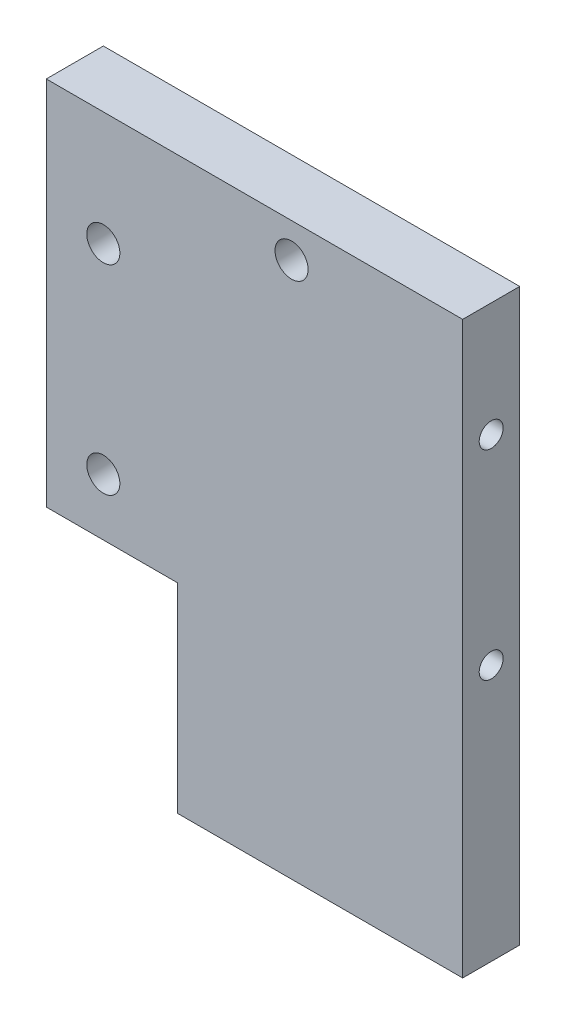
ISO-10303-21;
HEADER;
FILE_DESCRIPTION(('STEP AP214'),'2;1');
FILE_NAME('part.step','',(''),(''),'','','');
FILE_SCHEMA(('AUTOMOTIVE_DESIGN { 1 0 10303 214 1 1 1 1 }'));
ENDSEC;
DATA;
#1=APPLICATION_CONTEXT('core data for automotive mechanical design processes');
#2=APPLICATION_PROTOCOL_DEFINITION('international standard','automotive_design',2000,#1);
#3=PRODUCT_CONTEXT('',#1,'mechanical');
#4=PRODUCT('Part','Part','',(#3));
#5=PRODUCT_RELATED_PRODUCT_CATEGORY('part','',(#4));
#6=PRODUCT_DEFINITION_FORMATION('','',#4);
#7=PRODUCT_DEFINITION_CONTEXT('part definition',#1,'design');
#8=PRODUCT_DEFINITION('design','',#6,#7);
#9=PRODUCT_DEFINITION_SHAPE('','',#8);
#10=(LENGTH_UNIT() NAMED_UNIT(*) SI_UNIT(.MILLI.,.METRE.));
#11=(NAMED_UNIT(*) PLANE_ANGLE_UNIT() SI_UNIT($,.RADIAN.));
#12=(NAMED_UNIT(*) SI_UNIT($,.STERADIAN.) SOLID_ANGLE_UNIT());
#13=UNCERTAINTY_MEASURE_WITH_UNIT(LENGTH_MEASURE(1.E-05),#10,'distance_accuracy_value','');
#14=(GEOMETRIC_REPRESENTATION_CONTEXT(3) GLOBAL_UNCERTAINTY_ASSIGNED_CONTEXT((#13)) GLOBAL_UNIT_ASSIGNED_CONTEXT((#10,
#11,#12)) REPRESENTATION_CONTEXT('',''));
#15=CARTESIAN_POINT('',(0.,0.,0.));
#16=DIRECTION('',(0.,0.,1.));
#17=DIRECTION('',(1.,0.,0.));
#18=AXIS2_PLACEMENT_3D('',#15,#16,#17);
#19=CARTESIAN_POINT('',(0.,0.,10.));
#20=DIRECTION('',(1.,0.,0.));
#21=DIRECTION('',(0.,0.,-1.));
#22=AXIS2_PLACEMENT_3D('',#19,#20,#21);
#23=PLANE('',#22);
#24=DIRECTION('',(0.,-1.,0.));
#25=VECTOR('',#24,1.);
#26=CARTESIAN_POINT('',(0.,0.,0.));
#27=LINE('',#26,#25);
#28=CARTESIAN_POINT('',(0.,100.,0.));
#29=VERTEX_POINT('',#28);
#30=CARTESIAN_POINT('',(0.,35.,0.));
#31=VERTEX_POINT('',#30);
#32=EDGE_CURVE('E113',#29,#31,#27,.T.);
#33=ORIENTED_EDGE('',*,*,#32,.T.);
#34=DIRECTION('',(0.,0.,-1.));
#35=VECTOR('',#34,1.);
#36=CARTESIAN_POINT('',(0.,35.,10.));
#37=LINE('',#36,#35);
#38=CARTESIAN_POINT('',(0.,35.,10.));
#39=VERTEX_POINT('',#38);
#40=EDGE_CURVE('E48',#39,#31,#37,.T.);
#41=ORIENTED_EDGE('',*,*,#40,.F.);
#42=DIRECTION('',(0.,-1.,0.));
#43=VECTOR('',#42,1.);
#44=CARTESIAN_POINT('',(0.,0.,10.));
#45=LINE('',#44,#43);
#46=CARTESIAN_POINT('',(0.,100.,10.));
#47=VERTEX_POINT('',#46);
#48=EDGE_CURVE('E111',#47,#39,#45,.T.);
#49=ORIENTED_EDGE('',*,*,#48,.F.);
#50=DIRECTION('',(0.,0.,-1.));
#51=VECTOR('',#50,1.);
#52=CARTESIAN_POINT('',(0.,100.,10.));
#53=LINE('',#52,#51);
#54=EDGE_CURVE('E127',#47,#29,#53,.T.);
#55=ORIENTED_EDGE('',*,*,#54,.T.);
#56=EDGE_LOOP('',(#33,#41,#49,#55));
#57=FACE_BOUND('',#56,.T.);
#58=ADVANCED_FACE('F34',(#57),#23,.F.);
#59=CARTESIAN_POINT('',(0.,0.,10.));
#60=DIRECTION('',(0.,1.,0.));
#61=DIRECTION('',(0.,0.,1.));
#62=AXIS2_PLACEMENT_3D('',#59,#60,#61);
#63=PLANE('',#62);
#64=DIRECTION('',(1.,0.,0.));
#65=VECTOR('',#64,1.);
#66=CARTESIAN_POINT('',(0.,0.,10.));
#67=LINE('',#66,#65);
#68=CARTESIAN_POINT('',(23.,0.,10.));
#69=VERTEX_POINT('',#68);
#70=CARTESIAN_POINT('',(73.,0.,10.));
#71=VERTEX_POINT('',#70);
#72=EDGE_CURVE('E79',#69,#71,#67,.T.);
#73=ORIENTED_EDGE('',*,*,#72,.F.);
#74=DIRECTION('',(0.,0.,-1.));
#75=VECTOR('',#74,1.);
#76=CARTESIAN_POINT('',(23.,0.,10.));
#77=LINE('',#76,#75);
#78=CARTESIAN_POINT('',(23.,0.,0.));
#79=VERTEX_POINT('',#78);
#80=EDGE_CURVE('E147',#69,#79,#77,.T.);
#81=ORIENTED_EDGE('',*,*,#80,.T.);
#82=DIRECTION('',(1.,0.,0.));
#83=VECTOR('',#82,1.);
#84=CARTESIAN_POINT('',(0.,0.,0.));
#85=LINE('',#84,#83);
#86=CARTESIAN_POINT('',(73.,0.,0.));
#87=VERTEX_POINT('',#86);
#88=EDGE_CURVE('E129',#79,#87,#85,.T.);
#89=ORIENTED_EDGE('',*,*,#88,.T.);
#90=DIRECTION('',(0.,0.,-1.));
#91=VECTOR('',#90,1.);
#92=CARTESIAN_POINT('',(73.,0.,10.));
#93=LINE('',#92,#91);
#94=EDGE_CURVE('E11',#71,#87,#93,.T.);
#95=ORIENTED_EDGE('',*,*,#94,.F.);
#96=EDGE_LOOP('',(#73,#81,#89,#95));
#97=FACE_BOUND('',#96,.T.);
#98=ADVANCED_FACE('F215',(#97),#63,.F.);
#99=CARTESIAN_POINT('',(73.,0.,10.));
#100=DIRECTION('',(-1.,0.,0.));
#101=DIRECTION('',(0.,0.,1.));
#102=AXIS2_PLACEMENT_3D('',#99,#100,#101);
#103=PLANE('',#102);
#104=CARTESIAN_POINT('',(73.,80.0000000000001,4.99999999999991));
#105=DIRECTION('',(1.,0.,0.));
#106=DIRECTION('',(0.,0.,-1.));
#107=AXIS2_PLACEMENT_3D('',#104,#105,#106);
#108=CIRCLE('',#107,2.1);
#109=CARTESIAN_POINT('',(73.,80.0000000000001,2.89999999999991));
#110=VERTEX_POINT('',#109);
#111=EDGE_CURVE('E150',#110,#110,#108,.T.);
#112=ORIENTED_EDGE('',*,*,#111,.F.);
#113=EDGE_LOOP('',(#112));
#114=FACE_BOUND('',#113,.T.);
#115=CARTESIAN_POINT('',(73.,45.0000000000001,4.99999999999991));
#116=DIRECTION('',(1.,0.,0.));
#117=DIRECTION('',(0.,0.,-1.));
#118=AXIS2_PLACEMENT_3D('',#115,#116,#117);
#119=CIRCLE('',#118,2.1);
#120=CARTESIAN_POINT('',(73.,45.0000000000001,2.89999999999991));
#121=VERTEX_POINT('',#120);
#122=EDGE_CURVE('E157',#121,#121,#119,.T.);
#123=ORIENTED_EDGE('',*,*,#122,.F.);
#124=EDGE_LOOP('',(#123));
#125=FACE_BOUND('',#124,.T.);
#126=DIRECTION('',(0.,1.,0.));
#127=VECTOR('',#126,1.);
#128=CARTESIAN_POINT('',(73.,0.,0.));
#129=LINE('',#128,#127);
#130=CARTESIAN_POINT('',(73.,100.,0.));
#131=VERTEX_POINT('',#130);
#132=EDGE_CURVE('E119',#87,#131,#129,.T.);
#133=ORIENTED_EDGE('',*,*,#132,.T.);
#134=DIRECTION('',(0.,0.,-1.));
#135=VECTOR('',#134,1.);
#136=CARTESIAN_POINT('',(73.,100.,10.));
#137=LINE('',#136,#135);
#138=CARTESIAN_POINT('',(73.,100.,10.));
#139=VERTEX_POINT('',#138);
#140=EDGE_CURVE('E41',#139,#131,#137,.T.);
#141=ORIENTED_EDGE('',*,*,#140,.F.);
#142=DIRECTION('',(0.,1.,0.));
#143=VECTOR('',#142,1.);
#144=CARTESIAN_POINT('',(73.,0.,10.));
#145=LINE('',#144,#143);
#146=EDGE_CURVE('E117',#71,#139,#145,.T.);
#147=ORIENTED_EDGE('',*,*,#146,.F.);
#148=ORIENTED_EDGE('',*,*,#94,.T.);
#149=EDGE_LOOP('',(#133,#141,#147,#148));
#150=FACE_BOUND('',#149,.T.);
#151=ADVANCED_FACE('F220',(#114,#125,#150),#103,.F.);
#152=CARTESIAN_POINT('',(0.,100.,10.));
#153=DIRECTION('',(0.,-1.,0.));
#154=DIRECTION('',(0.,0.,-1.));
#155=AXIS2_PLACEMENT_3D('',#152,#153,#154);
#156=PLANE('',#155);
#157=DIRECTION('',(-1.,0.,0.));
#158=VECTOR('',#157,1.);
#159=CARTESIAN_POINT('',(0.,100.,0.));
#160=LINE('',#159,#158);
#161=EDGE_CURVE('E74',#131,#29,#160,.T.);
#162=ORIENTED_EDGE('',*,*,#161,.T.);
#163=ORIENTED_EDGE('',*,*,#54,.F.);
#164=DIRECTION('',(-1.,0.,0.));
#165=VECTOR('',#164,1.);
#166=CARTESIAN_POINT('',(0.,100.,10.));
#167=LINE('',#166,#165);
#168=EDGE_CURVE('E57',#139,#47,#167,.T.);
#169=ORIENTED_EDGE('',*,*,#168,.F.);
#170=ORIENTED_EDGE('',*,*,#140,.T.);
#171=EDGE_LOOP('',(#162,#163,#169,#170));
#172=FACE_BOUND('',#171,.T.);
#173=ADVANCED_FACE('F133',(#172),#156,.F.);
#174=CARTESIAN_POINT('',(0.,100.,10.));
#175=DIRECTION('',(0.,0.,-1.));
#176=DIRECTION('',(-1.,0.,0.));
#177=AXIS2_PLACEMENT_3D('',#174,#175,#176);
#178=PLANE('',#177);
#179=CARTESIAN_POINT('',(10.,80.,10.));
#180=DIRECTION('',(0.,0.,-1.));
#181=DIRECTION('',(-1.,0.,0.));
#182=AXIS2_PLACEMENT_3D('',#179,#180,#181);
#183=CIRCLE('',#182,2.9);
#184=CARTESIAN_POINT('',(7.10000000000001,80.,10.));
#185=VERTEX_POINT('',#184);
#186=EDGE_CURVE('E172',#185,#185,#183,.T.);
#187=ORIENTED_EDGE('',*,*,#186,.T.);
#188=EDGE_LOOP('',(#187));
#189=FACE_BOUND('',#188,.T.);
#190=CARTESIAN_POINT('',(43.,94.,10.));
#191=DIRECTION('',(0.,0.,-1.));
#192=DIRECTION('',(-1.,0.,0.));
#193=AXIS2_PLACEMENT_3D('',#190,#191,#192);
#194=CIRCLE('',#193,2.9);
#195=CARTESIAN_POINT('',(40.1,94.,10.));
#196=VERTEX_POINT('',#195);
#197=EDGE_CURVE('E184',#196,#196,#194,.T.);
#198=ORIENTED_EDGE('',*,*,#197,.T.);
#199=EDGE_LOOP('',(#198));
#200=FACE_BOUND('',#199,.T.);
#201=CARTESIAN_POINT('',(10.,45.,10.));
#202=DIRECTION('',(0.,0.,-1.));
#203=DIRECTION('',(-1.,0.,0.));
#204=AXIS2_PLACEMENT_3D('',#201,#202,#203);
#205=CIRCLE('',#204,2.9);
#206=CARTESIAN_POINT('',(7.10000000000001,45.,10.));
#207=VERTEX_POINT('',#206);
#208=EDGE_CURVE('E122',#207,#207,#205,.T.);
#209=ORIENTED_EDGE('',*,*,#208,.T.);
#210=EDGE_LOOP('',(#209));
#211=FACE_BOUND('',#210,.T.);
#212=DIRECTION('',(1.,0.,0.));
#213=VECTOR('',#212,1.);
#214=CARTESIAN_POINT('',(0.,35.,10.));
#215=LINE('',#214,#213);
#216=CARTESIAN_POINT('',(23.,35.,10.));
#217=VERTEX_POINT('',#216);
#218=EDGE_CURVE('E101',#39,#217,#215,.T.);
#219=ORIENTED_EDGE('',*,*,#218,.T.);
#220=DIRECTION('',(0.,-1.,0.));
#221=VECTOR('',#220,1.);
#222=CARTESIAN_POINT('',(23.,0.,10.));
#223=LINE('',#222,#221);
#224=EDGE_CURVE('E105',#217,#69,#223,.T.);
#225=ORIENTED_EDGE('',*,*,#224,.T.);
#226=ORIENTED_EDGE('',*,*,#72,.T.);
#227=ORIENTED_EDGE('',*,*,#146,.T.);
#228=ORIENTED_EDGE('',*,*,#168,.T.);
#229=ORIENTED_EDGE('',*,*,#48,.T.);
#230=EDGE_LOOP('',(#219,#225,#226,#227,#228,#229));
#231=FACE_BOUND('',#230,.T.);
#232=ADVANCED_FACE('F115',(#189,#200,#211,#231),#178,.F.);
#233=CARTESIAN_POINT('',(0.,100.,0.));
#234=DIRECTION('',(0.,0.,-1.));
#235=DIRECTION('',(-1.,0.,0.));
#236=AXIS2_PLACEMENT_3D('',#233,#234,#235);
#237=PLANE('',#236);
#238=DIRECTION('',(0.,-1.,0.));
#239=VECTOR('',#238,1.);
#240=CARTESIAN_POINT('',(23.,0.,0.));
#241=LINE('',#240,#239);
#242=CARTESIAN_POINT('',(23.,35.,0.));
#243=VERTEX_POINT('',#242);
#244=EDGE_CURVE('E106',#243,#79,#241,.T.);
#245=ORIENTED_EDGE('',*,*,#244,.F.);
#246=DIRECTION('',(1.,0.,0.));
#247=VECTOR('',#246,1.);
#248=CARTESIAN_POINT('',(0.,35.,0.));
#249=LINE('',#248,#247);
#250=EDGE_CURVE('E142',#31,#243,#249,.T.);
#251=ORIENTED_EDGE('',*,*,#250,.F.);
#252=ORIENTED_EDGE('',*,*,#32,.F.);
#253=ORIENTED_EDGE('',*,*,#161,.F.);
#254=ORIENTED_EDGE('',*,*,#132,.F.);
#255=ORIENTED_EDGE('',*,*,#88,.F.);
#256=EDGE_LOOP('',(#245,#251,#252,#253,#254,#255));
#257=FACE_BOUND('',#256,.T.);
#258=CARTESIAN_POINT('',(10.,80.,0.));
#259=DIRECTION('',(0.,0.,-1.));
#260=DIRECTION('',(-1.,0.,0.));
#261=AXIS2_PLACEMENT_3D('',#258,#259,#260);
#262=CIRCLE('',#261,4.99999999999999);
#263=CARTESIAN_POINT('',(5.00000000000002,80.,0.));
#264=VERTEX_POINT('',#263);
#265=EDGE_CURVE('E163',#264,#264,#262,.T.);
#266=ORIENTED_EDGE('',*,*,#265,.F.);
#267=EDGE_LOOP('',(#266));
#268=FACE_BOUND('',#267,.T.);
#269=CARTESIAN_POINT('',(43.,94.,0.));
#270=DIRECTION('',(0.,0.,-1.));
#271=DIRECTION('',(-1.,0.,0.));
#272=AXIS2_PLACEMENT_3D('',#269,#270,#271);
#273=CIRCLE('',#272,4.99999999999999);
#274=CARTESIAN_POINT('',(38.,94.,0.));
#275=VERTEX_POINT('',#274);
#276=EDGE_CURVE('E175',#275,#275,#273,.T.);
#277=ORIENTED_EDGE('',*,*,#276,.F.);
#278=EDGE_LOOP('',(#277));
#279=FACE_BOUND('',#278,.T.);
#280=CARTESIAN_POINT('',(10.,45.,0.));
#281=DIRECTION('',(0.,0.,-1.));
#282=DIRECTION('',(-1.,0.,0.));
#283=AXIS2_PLACEMENT_3D('',#280,#281,#282);
#284=CIRCLE('',#283,4.99999999999999);
#285=CARTESIAN_POINT('',(5.00000000000002,45.,0.));
#286=VERTEX_POINT('',#285);
#287=EDGE_CURVE('E187',#286,#286,#284,.T.);
#288=ORIENTED_EDGE('',*,*,#287,.F.);
#289=EDGE_LOOP('',(#288));
#290=FACE_BOUND('',#289,.T.);
#291=ADVANCED_FACE('F139',(#257,#268,#279,#290),#237,.T.);
#292=CARTESIAN_POINT('',(10.,45.,0.));
#293=DIRECTION('',(0.,0.,-1.));
#294=DIRECTION('',(-1.,0.,0.));
#295=AXIS2_PLACEMENT_3D('',#292,#293,#294);
#296=CYLINDRICAL_SURFACE('',#295,2.9);
#297=ORIENTED_EDGE('',*,*,#208,.F.);
#298=EDGE_LOOP('',(#297));
#299=FACE_BOUND('',#298,.T.);
#300=CARTESIAN_POINT('',(10.,45.,5.));
#301=DIRECTION('',(0.,0.,-1.));
#302=DIRECTION('',(-1.,0.,0.));
#303=AXIS2_PLACEMENT_3D('',#300,#301,#302);
#304=CIRCLE('',#303,2.90000000000001);
#305=CARTESIAN_POINT('',(7.1,45.,5.));
#306=VERTEX_POINT('',#305);
#307=EDGE_CURVE('E192',#306,#306,#304,.T.);
#308=ORIENTED_EDGE('',*,*,#307,.T.);
#309=EDGE_LOOP('',(#308));
#310=FACE_BOUND('',#309,.T.);
#311=ADVANCED_FACE('F200',(#299,#310),#296,.F.);
#312=CARTESIAN_POINT('',(12.9,45.,5.));
#313=DIRECTION('',(0.,0.,1.));
#314=DIRECTION('',(1.,0.,0.));
#315=AXIS2_PLACEMENT_3D('',#312,#313,#314);
#316=PLANE('',#315);
#317=ORIENTED_EDGE('',*,*,#307,.F.);
#318=EDGE_LOOP('',(#317));
#319=FACE_BOUND('',#318,.T.);
#320=CARTESIAN_POINT('',(10.,45.,5.));
#321=DIRECTION('',(0.,0.,-1.));
#322=DIRECTION('',(-1.,0.,0.));
#323=AXIS2_PLACEMENT_3D('',#320,#321,#322);
#324=CIRCLE('',#323,4.99999999999999);
#325=CARTESIAN_POINT('',(5.00000000000002,45.,5.));
#326=VERTEX_POINT('',#325);
#327=EDGE_CURVE('E190',#326,#326,#324,.T.);
#328=ORIENTED_EDGE('',*,*,#327,.T.);
#329=EDGE_LOOP('',(#328));
#330=FACE_BOUND('',#329,.T.);
#331=ADVANCED_FACE('F202',(#319,#330),#316,.F.);
#332=CARTESIAN_POINT('',(10.,45.,0.));
#333=DIRECTION('',(0.,0.,-1.));
#334=DIRECTION('',(-1.,0.,0.));
#335=AXIS2_PLACEMENT_3D('',#332,#333,#334);
#336=CYLINDRICAL_SURFACE('',#335,4.99999999999999);
#337=ORIENTED_EDGE('',*,*,#327,.F.);
#338=EDGE_LOOP('',(#337));
#339=FACE_BOUND('',#338,.T.);
#340=ORIENTED_EDGE('',*,*,#287,.T.);
#341=EDGE_LOOP('',(#340));
#342=FACE_BOUND('',#341,.T.);
#343=ADVANCED_FACE('F208',(#339,#342),#336,.F.);
#344=CARTESIAN_POINT('',(43.,94.,0.));
#345=DIRECTION('',(0.,0.,-1.));
#346=DIRECTION('',(-1.,0.,0.));
#347=AXIS2_PLACEMENT_3D('',#344,#345,#346);
#348=CYLINDRICAL_SURFACE('',#347,2.90000000000001);
#349=ORIENTED_EDGE('',*,*,#197,.F.);
#350=EDGE_LOOP('',(#349));
#351=FACE_BOUND('',#350,.T.);
#352=CARTESIAN_POINT('',(43.,94.,5.));
#353=DIRECTION('',(0.,0.,-1.));
#354=DIRECTION('',(-1.,0.,0.));
#355=AXIS2_PLACEMENT_3D('',#352,#353,#354);
#356=CIRCLE('',#355,2.90000000000001);
#357=CARTESIAN_POINT('',(40.1,94.,5.));
#358=VERTEX_POINT('',#357);
#359=EDGE_CURVE('E181',#358,#358,#356,.T.);
#360=ORIENTED_EDGE('',*,*,#359,.T.);
#361=EDGE_LOOP('',(#360));
#362=FACE_BOUND('',#361,.T.);
#363=ADVANCED_FACE('F237',(#351,#362),#348,.F.);
#364=CARTESIAN_POINT('',(45.9,94.,5.));
#365=DIRECTION('',(0.,0.,1.));
#366=DIRECTION('',(1.,0.,0.));
#367=AXIS2_PLACEMENT_3D('',#364,#365,#366);
#368=PLANE('',#367);
#369=ORIENTED_EDGE('',*,*,#359,.F.);
#370=EDGE_LOOP('',(#369));
#371=FACE_BOUND('',#370,.T.);
#372=CARTESIAN_POINT('',(43.,94.,5.));
#373=DIRECTION('',(0.,0.,-1.));
#374=DIRECTION('',(-1.,0.,0.));
#375=AXIS2_PLACEMENT_3D('',#372,#373,#374);
#376=CIRCLE('',#375,4.99999999999999);
#377=CARTESIAN_POINT('',(38.,94.,5.));
#378=VERTEX_POINT('',#377);
#379=EDGE_CURVE('E178',#378,#378,#376,.T.);
#380=ORIENTED_EDGE('',*,*,#379,.T.);
#381=EDGE_LOOP('',(#380));
#382=FACE_BOUND('',#381,.T.);
#383=ADVANCED_FACE('F240',(#371,#382),#368,.F.);
#384=CARTESIAN_POINT('',(43.,94.,0.));
#385=DIRECTION('',(0.,0.,-1.));
#386=DIRECTION('',(-1.,0.,0.));
#387=AXIS2_PLACEMENT_3D('',#384,#385,#386);
#388=CYLINDRICAL_SURFACE('',#387,4.99999999999999);
#389=ORIENTED_EDGE('',*,*,#379,.F.);
#390=EDGE_LOOP('',(#389));
#391=FACE_BOUND('',#390,.T.);
#392=ORIENTED_EDGE('',*,*,#276,.T.);
#393=EDGE_LOOP('',(#392));
#394=FACE_BOUND('',#393,.T.);
#395=ADVANCED_FACE('F246',(#391,#394),#388,.F.);
#396=CARTESIAN_POINT('',(10.,80.,0.));
#397=DIRECTION('',(0.,0.,-1.));
#398=DIRECTION('',(-1.,0.,0.));
#399=AXIS2_PLACEMENT_3D('',#396,#397,#398);
#400=CYLINDRICAL_SURFACE('',#399,2.9);
#401=ORIENTED_EDGE('',*,*,#186,.F.);
#402=EDGE_LOOP('',(#401));
#403=FACE_BOUND('',#402,.T.);
#404=CARTESIAN_POINT('',(10.,80.,5.));
#405=DIRECTION('',(0.,0.,-1.));
#406=DIRECTION('',(-1.,0.,0.));
#407=AXIS2_PLACEMENT_3D('',#404,#405,#406);
#408=CIRCLE('',#407,2.90000000000001);
#409=CARTESIAN_POINT('',(7.1,80.,5.));
#410=VERTEX_POINT('',#409);
#411=EDGE_CURVE('E169',#410,#410,#408,.T.);
#412=ORIENTED_EDGE('',*,*,#411,.T.);
#413=EDGE_LOOP('',(#412));
#414=FACE_BOUND('',#413,.T.);
#415=ADVANCED_FACE('F252',(#403,#414),#400,.F.);
#416=CARTESIAN_POINT('',(12.9,80.,5.));
#417=DIRECTION('',(0.,0.,1.));
#418=DIRECTION('',(1.,0.,0.));
#419=AXIS2_PLACEMENT_3D('',#416,#417,#418);
#420=PLANE('',#419);
#421=ORIENTED_EDGE('',*,*,#411,.F.);
#422=EDGE_LOOP('',(#421));
#423=FACE_BOUND('',#422,.T.);
#424=CARTESIAN_POINT('',(10.,80.,5.));
#425=DIRECTION('',(0.,0.,-1.));
#426=DIRECTION('',(-1.,0.,0.));
#427=AXIS2_PLACEMENT_3D('',#424,#425,#426);
#428=CIRCLE('',#427,4.99999999999999);
#429=CARTESIAN_POINT('',(5.00000000000002,80.,5.));
#430=VERTEX_POINT('',#429);
#431=EDGE_CURVE('E166',#430,#430,#428,.T.);
#432=ORIENTED_EDGE('',*,*,#431,.T.);
#433=EDGE_LOOP('',(#432));
#434=FACE_BOUND('',#433,.T.);
#435=ADVANCED_FACE('F268',(#423,#434),#420,.F.);
#436=CARTESIAN_POINT('',(10.,80.,0.));
#437=DIRECTION('',(0.,0.,-1.));
#438=DIRECTION('',(-1.,0.,0.));
#439=AXIS2_PLACEMENT_3D('',#436,#437,#438);
#440=CYLINDRICAL_SURFACE('',#439,4.99999999999999);
#441=ORIENTED_EDGE('',*,*,#431,.F.);
#442=EDGE_LOOP('',(#441));
#443=FACE_BOUND('',#442,.T.);
#444=ORIENTED_EDGE('',*,*,#265,.T.);
#445=EDGE_LOOP('',(#444));
#446=FACE_BOUND('',#445,.T.);
#447=ADVANCED_FACE('F272',(#443,#446),#440,.F.);
#448=CARTESIAN_POINT('',(60.6,45.0000000000001,4.99999999999991));
#449=DIRECTION('',(1.,0.,0.));
#450=DIRECTION('',(0.,0.,-1.));
#451=AXIS2_PLACEMENT_3D('',#448,#449,#450);
#452=CONICAL_SURFACE('',#451,2.1,1.02974425867665);
#453=CARTESIAN_POINT('',(59.3381927000421,45.0000000000001,4.99999999999991));
#454=VERTEX_POINT('',#453);
#455=VERTEX_LOOP('',#454);
#456=FACE_BOUND('',#455,.T.);
#457=CARTESIAN_POINT('',(60.6,45.0000000000001,4.99999999999991));
#458=DIRECTION('',(1.,0.,0.));
#459=DIRECTION('',(0.,0.,-1.));
#460=AXIS2_PLACEMENT_3D('',#457,#458,#459);
#461=CIRCLE('',#460,2.1);
#462=CARTESIAN_POINT('',(60.6,45.0000000000001,2.89999999999991));
#463=VERTEX_POINT('',#462);
#464=EDGE_CURVE('E160',#463,#463,#461,.T.);
#465=ORIENTED_EDGE('',*,*,#464,.T.);
#466=EDGE_LOOP('',(#465));
#467=FACE_BOUND('',#466,.T.);
#468=ADVANCED_FACE('F276',(#456,#467),#452,.F.);
#469=CARTESIAN_POINT('',(73.,45.0000000000001,4.99999999999991));
#470=DIRECTION('',(1.,0.,0.));
#471=DIRECTION('',(0.,0.,-1.));
#472=AXIS2_PLACEMENT_3D('',#469,#470,#471);
#473=CYLINDRICAL_SURFACE('',#472,2.1);
#474=ORIENTED_EDGE('',*,*,#464,.F.);
#475=EDGE_LOOP('',(#474));
#476=FACE_BOUND('',#475,.T.);
#477=ORIENTED_EDGE('',*,*,#122,.T.);
#478=EDGE_LOOP('',(#477));
#479=FACE_BOUND('',#478,.T.);
#480=ADVANCED_FACE('F280',(#476,#479),#473,.F.);
#481=CARTESIAN_POINT('',(60.6,80.0000000000001,4.99999999999991));
#482=DIRECTION('',(1.,0.,0.));
#483=DIRECTION('',(0.,0.,-1.));
#484=AXIS2_PLACEMENT_3D('',#481,#482,#483);
#485=CONICAL_SURFACE('',#484,2.09999999999999,1.02974425867665);
#486=CARTESIAN_POINT('',(59.3381927000421,80.0000000000001,4.99999999999991));
#487=VERTEX_POINT('',#486);
#488=VERTEX_LOOP('',#487);
#489=FACE_BOUND('',#488,.T.);
#490=CARTESIAN_POINT('',(60.6,80.0000000000001,4.99999999999991));
#491=DIRECTION('',(1.,0.,0.));
#492=DIRECTION('',(0.,0.,-1.));
#493=AXIS2_PLACEMENT_3D('',#490,#491,#492);
#494=CIRCLE('',#493,2.09999999999999);
#495=CARTESIAN_POINT('',(60.6,80.0000000000001,2.89999999999992));
#496=VERTEX_POINT('',#495);
#497=EDGE_CURVE('E154',#496,#496,#494,.T.);
#498=ORIENTED_EDGE('',*,*,#497,.T.);
#499=EDGE_LOOP('',(#498));
#500=FACE_BOUND('',#499,.T.);
#501=ADVANCED_FACE('F284',(#489,#500),#485,.F.);
#502=CARTESIAN_POINT('',(73.,80.0000000000001,4.99999999999991));
#503=DIRECTION('',(1.,0.,0.));
#504=DIRECTION('',(0.,0.,-1.));
#505=AXIS2_PLACEMENT_3D('',#502,#503,#504);
#506=CYLINDRICAL_SURFACE('',#505,2.1);
#507=ORIENTED_EDGE('',*,*,#497,.F.);
#508=EDGE_LOOP('',(#507));
#509=FACE_BOUND('',#508,.T.);
#510=ORIENTED_EDGE('',*,*,#111,.T.);
#511=EDGE_LOOP('',(#510));
#512=FACE_BOUND('',#511,.T.);
#513=ADVANCED_FACE('F288',(#509,#512),#506,.F.);
#514=CARTESIAN_POINT('',(23.,0.,10.));
#515=DIRECTION('',(1.,0.,0.));
#516=DIRECTION('',(0.,0.,-1.));
#517=AXIS2_PLACEMENT_3D('',#514,#515,#516);
#518=PLANE('',#517);
#519=ORIENTED_EDGE('',*,*,#244,.T.);
#520=ORIENTED_EDGE('',*,*,#80,.F.);
#521=ORIENTED_EDGE('',*,*,#224,.F.);
#522=DIRECTION('',(0.,0.,-1.));
#523=VECTOR('',#522,1.);
#524=CARTESIAN_POINT('',(23.,35.,10.));
#525=LINE('',#524,#523);
#526=EDGE_CURVE('E103',#217,#243,#525,.T.);
#527=ORIENTED_EDGE('',*,*,#526,.T.);
#528=EDGE_LOOP('',(#519,#520,#521,#527));
#529=FACE_BOUND('',#528,.T.);
#530=ADVANCED_FACE('F292',(#529),#518,.F.);
#531=CARTESIAN_POINT('',(0.,35.,10.));
#532=DIRECTION('',(0.,1.,0.));
#533=DIRECTION('',(0.,0.,1.));
#534=AXIS2_PLACEMENT_3D('',#531,#532,#533);
#535=PLANE('',#534);
#536=ORIENTED_EDGE('',*,*,#250,.T.);
#537=ORIENTED_EDGE('',*,*,#526,.F.);
#538=ORIENTED_EDGE('',*,*,#218,.F.);
#539=ORIENTED_EDGE('',*,*,#40,.T.);
#540=EDGE_LOOP('',(#536,#537,#538,#539));
#541=FACE_BOUND('',#540,.T.);
#542=ADVANCED_FACE('F102',(#541),#535,.F.);
#543=CLOSED_SHELL('',(#58,#98,#151,#173,#232,#291,#311,#331,#343,#363,#383,#395,#415,#435,#447,
#468,#480,#501,#513,#530,#542));
#544=MANIFOLD_SOLID_BREP('B2',#543);
#545=ADVANCED_BREP_SHAPE_REPRESENTATION('',(#18,#544),#14);
#546=SHAPE_DEFINITION_REPRESENTATION(#9,#545);
ENDSEC;
END-ISO-10303-21;
